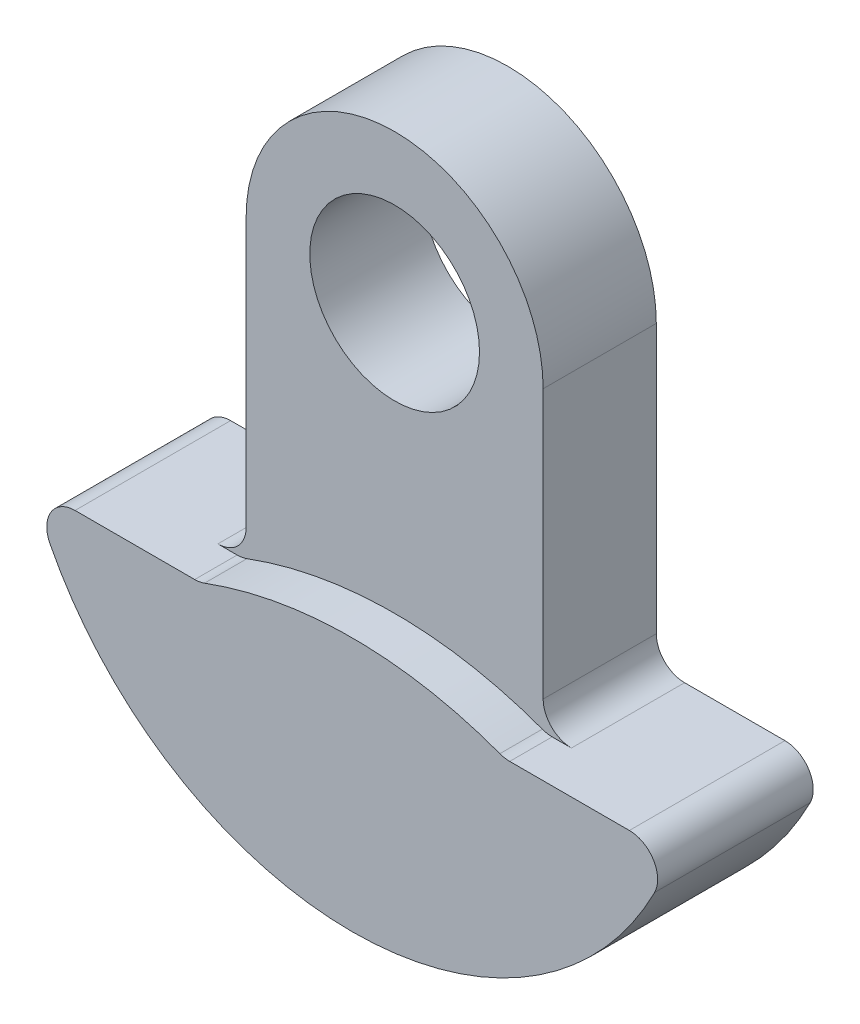
ISO-10303-21;
HEADER;
FILE_DESCRIPTION(('STEP AP214'),'2;1');
FILE_NAME('part.step','',(''),(''),'','','');
FILE_SCHEMA(('AUTOMOTIVE_DESIGN { 1 0 10303 214 1 1 1 1 }'));
ENDSEC;
DATA;
#1=APPLICATION_CONTEXT('core data for automotive mechanical design processes');
#2=APPLICATION_PROTOCOL_DEFINITION('international standard','automotive_design',2000,#1);
#3=PRODUCT_CONTEXT('',#1,'mechanical');
#4=PRODUCT('Part','Part','',(#3));
#5=PRODUCT_RELATED_PRODUCT_CATEGORY('part','',(#4));
#6=PRODUCT_DEFINITION_FORMATION('','',#4);
#7=PRODUCT_DEFINITION_CONTEXT('part definition',#1,'design');
#8=PRODUCT_DEFINITION('design','',#6,#7);
#9=PRODUCT_DEFINITION_SHAPE('','',#8);
#10=(LENGTH_UNIT() NAMED_UNIT(*) SI_UNIT(.MILLI.,.METRE.));
#11=(NAMED_UNIT(*) PLANE_ANGLE_UNIT() SI_UNIT($,.RADIAN.));
#12=(NAMED_UNIT(*) SI_UNIT($,.STERADIAN.) SOLID_ANGLE_UNIT());
#13=UNCERTAINTY_MEASURE_WITH_UNIT(LENGTH_MEASURE(1.E-05),#10,'distance_accuracy_value','');
#14=(GEOMETRIC_REPRESENTATION_CONTEXT(3) GLOBAL_UNCERTAINTY_ASSIGNED_CONTEXT((#13)) GLOBAL_UNIT_ASSIGNED_CONTEXT((#10,
#11,#12)) REPRESENTATION_CONTEXT('',''));
#15=CARTESIAN_POINT('',(0.,0.,0.));
#16=DIRECTION('',(0.,0.,1.));
#17=DIRECTION('',(1.,0.,0.));
#18=AXIS2_PLACEMENT_3D('',#15,#16,#17);
#19=CARTESIAN_POINT('',(-19.5959179422654,-10.,7.99999999999995));
#20=DIRECTION('',(0.,0.,-0.999999999999999));
#21=DIRECTION('',(-1.,0.,0.));
#22=AXIS2_PLACEMENT_3D('',#19,#20,#21);
#23=PLANE('',#22);
#24=CARTESIAN_POINT('',(0.,13.,7.99999999999999));
#25=DIRECTION('',(0.,0.,0.999999999999999));
#26=DIRECTION('',(1.,0.,0.));
#27=AXIS2_PLACEMENT_3D('',#24,#25,#26);
#28=CIRCLE('',#27,6.);
#29=CARTESIAN_POINT('',(6.00000000000002,13.,7.99999999999999));
#30=VERTEX_POINT('',#29);
#31=EDGE_CURVE('E283',#30,#30,#28,.T.);
#32=ORIENTED_EDGE('',*,*,#31,.F.);
#33=EDGE_LOOP('',(#32));
#34=FACE_BOUND('',#33,.T.);
#35=DIRECTION('',(-1.,0.,0.));
#36=VECTOR('',#35,1.);
#37=CARTESIAN_POINT('',(-19.5959179422654,-8.00000000000002,7.99999999999995));
#38=LINE('',#37,#36);
#39=CARTESIAN_POINT('',(-11.1355287256601,-8.00000000000001,7.99999999999995));
#40=VERTEX_POINT('',#39);
#41=CARTESIAN_POINT('',(-12.5,-8.00000000000001,7.99999999999995));
#42=VERTEX_POINT('',#41);
#43=EDGE_CURVE('E49',#40,#42,#38,.T.);
#44=ORIENTED_EDGE('',*,*,#43,.F.);
#45=CARTESIAN_POINT('',(-11.1355287256601,-6.00000000000001,7.99999999999995));
#46=DIRECTION('',(0.,0.,-0.999999999999999));
#47=DIRECTION('',(1.,0.,0.));
#48=AXIS2_PLACEMENT_3D('',#45,#46,#47);
#49=CIRCLE('',#48,2.);
#50=CARTESIAN_POINT('',(-10.4395581803063,-7.87500000000002,7.99999999999995));
#51=VERTEX_POINT('',#50);
#52=EDGE_CURVE('E53',#51,#40,#49,.T.);
#53=ORIENTED_EDGE('',*,*,#52,.F.);
#54=CARTESIAN_POINT('',(0.,-36.,7.99999999999999));
#55=DIRECTION('',(0.,0.,0.999999999999999));
#56=DIRECTION('',(1.,0.,0.));
#57=AXIS2_PLACEMENT_3D('',#54,#55,#56);
#58=CIRCLE('',#57,30.);
#59=CARTESIAN_POINT('',(10.4395581803063,-7.875,7.99999999999999));
#60=VERTEX_POINT('',#59);
#61=EDGE_CURVE('E134',#60,#51,#58,.T.);
#62=ORIENTED_EDGE('',*,*,#61,.F.);
#63=CARTESIAN_POINT('',(11.1355287256601,-6.,7.99999999999999));
#64=DIRECTION('',(0.,0.,-0.999999999999999));
#65=DIRECTION('',(1.,0.,0.));
#66=AXIS2_PLACEMENT_3D('',#63,#64,#65);
#67=CIRCLE('',#66,2.);
#68=CARTESIAN_POINT('',(11.13552872566,-8.,7.99999999999999));
#69=VERTEX_POINT('',#68);
#70=EDGE_CURVE('E131',#69,#60,#67,.T.);
#71=ORIENTED_EDGE('',*,*,#70,.F.);
#72=DIRECTION('',(-1.,0.,0.));
#73=VECTOR('',#72,1.);
#74=CARTESIAN_POINT('',(11.13552872566,-8.,7.99999999999999));
#75=LINE('',#74,#73);
#76=CARTESIAN_POINT('',(12.5,-8.,7.99999999999999));
#77=VERTEX_POINT('',#76);
#78=EDGE_CURVE('E41',#77,#69,#75,.T.);
#79=ORIENTED_EDGE('',*,*,#78,.F.);
#80=CARTESIAN_POINT('',(12.5,-6.,7.99999999999999));
#81=DIRECTION('',(0.,0.,-0.999999999999999));
#82=DIRECTION('',(-1.,0.,0.));
#83=AXIS2_PLACEMENT_3D('',#80,#81,#82);
#84=CIRCLE('',#83,2.);
#85=CARTESIAN_POINT('',(10.5,-5.99999999999998,7.99999999999999));
#86=VERTEX_POINT('',#85);
#87=EDGE_CURVE('E176',#77,#86,#84,.T.);
#88=ORIENTED_EDGE('',*,*,#87,.T.);
#89=DIRECTION('',(0.,1.,0.));
#90=VECTOR('',#89,1.);
#91=CARTESIAN_POINT('',(10.5,13.,7.99999999999999));
#92=LINE('',#91,#90);
#93=CARTESIAN_POINT('',(10.5,13.,7.99999999999999));
#94=VERTEX_POINT('',#93);
#95=EDGE_CURVE('E178',#86,#94,#92,.T.);
#96=ORIENTED_EDGE('',*,*,#95,.T.);
#97=CARTESIAN_POINT('',(0.,13.,7.99999999999999));
#98=DIRECTION('',(0.,0.,0.999999999999999));
#99=DIRECTION('',(1.,0.,0.));
#100=AXIS2_PLACEMENT_3D('',#97,#98,#99);
#101=CIRCLE('',#100,10.5);
#102=CARTESIAN_POINT('',(-10.5,13.,7.99999999999995));
#103=VERTEX_POINT('',#102);
#104=EDGE_CURVE('E245',#94,#103,#101,.T.);
#105=ORIENTED_EDGE('',*,*,#104,.T.);
#106=DIRECTION('',(0.,-1.,0.));
#107=VECTOR('',#106,1.);
#108=CARTESIAN_POINT('',(-10.5,13.,7.99999999999995));
#109=LINE('',#108,#107);
#110=CARTESIAN_POINT('',(-10.5,-6.,7.99999999999995));
#111=VERTEX_POINT('',#110);
#112=EDGE_CURVE('E185',#103,#111,#109,.T.);
#113=ORIENTED_EDGE('',*,*,#112,.T.);
#114=CARTESIAN_POINT('',(-12.5,-6.00000000000001,7.99999999999995));
#115=DIRECTION('',(0.,0.,-0.999999999999999));
#116=DIRECTION('',(-1.,0.,0.));
#117=AXIS2_PLACEMENT_3D('',#114,#115,#116);
#118=CIRCLE('',#117,2.);
#119=EDGE_CURVE('E182',#111,#42,#118,.T.);
#120=ORIENTED_EDGE('',*,*,#119,.T.);
#121=EDGE_LOOP('',(#44,#53,#62,#71,#79,#88,#96,#105,#113,#120));
#122=FACE_BOUND('',#121,.T.);
#123=ADVANCED_FACE('F32',(#34,#122),#23,.F.);
#124=CARTESIAN_POINT('',(-19.5959179422654,-10.,7.99999999999995));
#125=DIRECTION('',(0.,0.,-0.999999999999999));
#126=DIRECTION('',(-1.,0.,0.));
#127=AXIS2_PLACEMENT_3D('',#124,#125,#126);
#128=CYLINDRICAL_SURFACE('',#127,2.);
#129=CARTESIAN_POINT('',(-19.5959179422654,-10.,0.));
#130=DIRECTION('',(0.,0.,0.999999999999999));
#131=DIRECTION('',(-1.,0.,0.));
#132=AXIS2_PLACEMENT_3D('',#129,#130,#131);
#133=CIRCLE('',#132,2.);
#134=CARTESIAN_POINT('',(-19.5959179422654,-8.00000000000002,0.));
#135=VERTEX_POINT('',#134);
#136=CARTESIAN_POINT('',(-21.3773650279259,-10.9090909090909,0.));
#137=VERTEX_POINT('',#136);
#138=EDGE_CURVE('E153',#135,#137,#133,.T.);
#139=ORIENTED_EDGE('',*,*,#138,.T.);
#140=DIRECTION('',(0.,0.,-0.999999999999999));
#141=VECTOR('',#140,1.);
#142=CARTESIAN_POINT('',(-21.3773650279259,-10.9090909090909,7.99999999999995));
#143=LINE('',#142,#141);
#144=CARTESIAN_POINT('',(-21.3773650279259,-10.9090909090909,11.));
#145=VERTEX_POINT('',#144);
#146=EDGE_CURVE('E149',#145,#137,#143,.T.);
#147=ORIENTED_EDGE('',*,*,#146,.F.);
#148=CARTESIAN_POINT('',(-19.5959179422654,-10.,11.));
#149=DIRECTION('',(0.,0.,0.999999999999999));
#150=DIRECTION('',(1.,0.,0.));
#151=AXIS2_PLACEMENT_3D('',#148,#149,#150);
#152=CIRCLE('',#151,2.);
#153=CARTESIAN_POINT('',(-19.5959179422654,-8.00000000000002,11.));
#154=VERTEX_POINT('',#153);
#155=EDGE_CURVE('E164',#154,#145,#152,.T.);
#156=ORIENTED_EDGE('',*,*,#155,.F.);
#157=DIRECTION('',(0.,0.,-0.999999999999999));
#158=VECTOR('',#157,1.);
#159=CARTESIAN_POINT('',(-19.5959179422654,-8.00000000000002,7.99999999999995));
#160=LINE('',#159,#158);
#161=EDGE_CURVE('E184',#154,#135,#160,.T.);
#162=ORIENTED_EDGE('',*,*,#161,.T.);
#163=EDGE_LOOP('',(#139,#147,#156,#162));
#164=FACE_BOUND('',#163,.T.);
#165=ADVANCED_FACE('F34',(#164),#128,.T.);
#166=CARTESIAN_POINT('',(0.,0.,7.99999999999999));
#167=DIRECTION('',(0.,0.,-0.999999999999999));
#168=DIRECTION('',(-1.,0.,0.));
#169=AXIS2_PLACEMENT_3D('',#166,#167,#168);
#170=CYLINDRICAL_SURFACE('',#169,24.);
#171=CARTESIAN_POINT('',(0.,0.,0.));
#172=DIRECTION('',(0.,0.,0.999999999999999));
#173=DIRECTION('',(1.,0.,0.));
#174=AXIS2_PLACEMENT_3D('',#171,#172,#173);
#175=CIRCLE('',#174,24.);
#176=CARTESIAN_POINT('',(21.3773650279259,-10.9090909090909,0.));
#177=VERTEX_POINT('',#176);
#178=EDGE_CURVE('E157',#137,#177,#175,.T.);
#179=ORIENTED_EDGE('',*,*,#178,.T.);
#180=DIRECTION('',(0.,0.,-0.999999999999999));
#181=VECTOR('',#180,1.);
#182=CARTESIAN_POINT('',(21.3773650279259,-10.9090909090909,7.99999999999999));
#183=LINE('',#182,#181);
#184=CARTESIAN_POINT('',(21.3773650279259,-10.9090909090909,11.));
#185=VERTEX_POINT('',#184);
#186=EDGE_CURVE('E215',#185,#177,#183,.T.);
#187=ORIENTED_EDGE('',*,*,#186,.F.);
#188=CARTESIAN_POINT('',(0.,0.,11.));
#189=DIRECTION('',(0.,0.,0.999999999999999));
#190=DIRECTION('',(1.,0.,0.));
#191=AXIS2_PLACEMENT_3D('',#188,#189,#190);
#192=CIRCLE('',#191,24.);
#193=EDGE_CURVE('E222',#145,#185,#192,.T.);
#194=ORIENTED_EDGE('',*,*,#193,.F.);
#195=ORIENTED_EDGE('',*,*,#146,.T.);
#196=EDGE_LOOP('',(#179,#187,#194,#195));
#197=FACE_BOUND('',#196,.T.);
#198=ADVANCED_FACE('F220',(#197),#170,.T.);
#199=CARTESIAN_POINT('',(19.5959179422654,-9.99999999999999,7.99999999999999));
#200=DIRECTION('',(0.,0.,-0.999999999999999));
#201=DIRECTION('',(-1.,0.,0.));
#202=AXIS2_PLACEMENT_3D('',#199,#200,#201);
#203=CYLINDRICAL_SURFACE('',#202,2.);
#204=CARTESIAN_POINT('',(19.5959179422654,-9.99999999999999,0.));
#205=DIRECTION('',(0.,0.,0.999999999999999));
#206=DIRECTION('',(1.,0.,0.));
#207=AXIS2_PLACEMENT_3D('',#204,#205,#206);
#208=CIRCLE('',#207,2.);
#209=CARTESIAN_POINT('',(19.5959179422654,-7.99999999999999,0.));
#210=VERTEX_POINT('',#209);
#211=EDGE_CURVE('E229',#177,#210,#208,.T.);
#212=ORIENTED_EDGE('',*,*,#211,.T.);
#213=DIRECTION('',(0.,0.,-0.999999999999999));
#214=VECTOR('',#213,1.);
#215=CARTESIAN_POINT('',(19.5959179422654,-7.99999999999999,7.99999999999999));
#216=LINE('',#215,#214);
#217=CARTESIAN_POINT('',(19.5959179422654,-7.99999999999999,11.));
#218=VERTEX_POINT('',#217);
#219=EDGE_CURVE('E172',#218,#210,#216,.T.);
#220=ORIENTED_EDGE('',*,*,#219,.F.);
#221=CARTESIAN_POINT('',(19.5959179422654,-9.99999999999999,11.));
#222=DIRECTION('',(0.,0.,0.999999999999999));
#223=DIRECTION('',(-1.,0.,0.));
#224=AXIS2_PLACEMENT_3D('',#221,#222,#223);
#225=CIRCLE('',#224,2.);
#226=EDGE_CURVE('E276',#185,#218,#225,.T.);
#227=ORIENTED_EDGE('',*,*,#226,.F.);
#228=ORIENTED_EDGE('',*,*,#186,.T.);
#229=EDGE_LOOP('',(#212,#220,#227,#228));
#230=FACE_BOUND('',#229,.T.);
#231=ADVANCED_FACE('F344',(#230),#203,.T.);
#232=CARTESIAN_POINT('',(19.5959179422654,-7.99999999999999,7.99999999999999));
#233=DIRECTION('',(0.,-1.,0.));
#234=DIRECTION('',(1.,0.,0.));
#235=AXIS2_PLACEMENT_3D('',#232,#233,#234);
#236=PLANE('',#235);
#237=DIRECTION('',(-1.,0.,0.));
#238=VECTOR('',#237,1.);
#239=CARTESIAN_POINT('',(19.5959179422654,-7.99999999999999,0.));
#240=LINE('',#239,#238);
#241=CARTESIAN_POINT('',(12.5,-8.,0.));
#242=VERTEX_POINT('',#241);
#243=EDGE_CURVE('E230',#210,#242,#240,.T.);
#244=ORIENTED_EDGE('',*,*,#243,.T.);
#245=DIRECTION('',(0.,0.,-0.999999999999999));
#246=VECTOR('',#245,1.);
#247=CARTESIAN_POINT('',(12.5,-8.,7.99999999999999));
#248=LINE('',#247,#246);
#249=EDGE_CURVE('E147',#77,#242,#248,.T.);
#250=ORIENTED_EDGE('',*,*,#249,.F.);
#251=ORIENTED_EDGE('',*,*,#78,.T.);
#252=DIRECTION('',(0.,0.,-0.999999999999999));
#253=VECTOR('',#252,1.);
#254=CARTESIAN_POINT('',(11.13552872566,-8.,11.));
#255=LINE('',#254,#253);
#256=CARTESIAN_POINT('',(11.13552872566,-8.,11.));
#257=VERTEX_POINT('',#256);
#258=EDGE_CURVE('E144',#257,#69,#255,.T.);
#259=ORIENTED_EDGE('',*,*,#258,.F.);
#260=DIRECTION('',(-1.,0.,0.));
#261=VECTOR('',#260,1.);
#262=CARTESIAN_POINT('',(11.13552872566,-8.,11.));
#263=LINE('',#262,#261);
#264=EDGE_CURVE('E274',#218,#257,#263,.T.);
#265=ORIENTED_EDGE('',*,*,#264,.F.);
#266=ORIENTED_EDGE('',*,*,#219,.T.);
#267=EDGE_LOOP('',(#244,#250,#251,#259,#265,#266));
#268=FACE_BOUND('',#267,.T.);
#269=ADVANCED_FACE('F142',(#268),#236,.F.);
#270=CARTESIAN_POINT('',(12.5,-6.,7.99999999999999));
#271=DIRECTION('',(0.,0.,-0.999999999999999));
#272=DIRECTION('',(-1.,0.,0.));
#273=AXIS2_PLACEMENT_3D('',#270,#271,#272);
#274=CYLINDRICAL_SURFACE('',#273,2.);
#275=CARTESIAN_POINT('',(12.5,-6.,0.));
#276=DIRECTION('',(0.,0.,-0.999999999999999));
#277=DIRECTION('',(-1.,0.,0.));
#278=AXIS2_PLACEMENT_3D('',#275,#276,#277);
#279=CIRCLE('',#278,2.);
#280=CARTESIAN_POINT('',(10.5,-5.99999999999999,0.));
#281=VERTEX_POINT('',#280);
#282=EDGE_CURVE('E234',#242,#281,#279,.T.);
#283=ORIENTED_EDGE('',*,*,#282,.T.);
#284=DIRECTION('',(0.,0.,-0.999999999999999));
#285=VECTOR('',#284,1.);
#286=CARTESIAN_POINT('',(10.5,-5.99999999999998,7.99999999999999));
#287=LINE('',#286,#285);
#288=EDGE_CURVE('E173',#86,#281,#287,.T.);
#289=ORIENTED_EDGE('',*,*,#288,.F.);
#290=ORIENTED_EDGE('',*,*,#87,.F.);
#291=ORIENTED_EDGE('',*,*,#249,.T.);
#292=EDGE_LOOP('',(#283,#289,#290,#291));
#293=FACE_BOUND('',#292,.T.);
#294=ADVANCED_FACE('F337',(#293),#274,.F.);
#295=CARTESIAN_POINT('',(10.5,13.,7.99999999999999));
#296=DIRECTION('',(-1.,0.,0.));
#297=DIRECTION('',(0.,-1.,0.));
#298=AXIS2_PLACEMENT_3D('',#295,#296,#297);
#299=PLANE('',#298);
#300=DIRECTION('',(0.,1.,0.));
#301=VECTOR('',#300,1.);
#302=CARTESIAN_POINT('',(10.5,13.,0.));
#303=LINE('',#302,#301);
#304=CARTESIAN_POINT('',(10.5,13.,0.));
#305=VERTEX_POINT('',#304);
#306=EDGE_CURVE('E236',#281,#305,#303,.T.);
#307=ORIENTED_EDGE('',*,*,#306,.T.);
#308=DIRECTION('',(0.,0.,-0.999999999999999));
#309=VECTOR('',#308,1.);
#310=CARTESIAN_POINT('',(10.5,13.,7.99999999999999));
#311=LINE('',#310,#309);
#312=EDGE_CURVE('E208',#94,#305,#311,.T.);
#313=ORIENTED_EDGE('',*,*,#312,.F.);
#314=ORIENTED_EDGE('',*,*,#95,.F.);
#315=ORIENTED_EDGE('',*,*,#288,.T.);
#316=EDGE_LOOP('',(#307,#313,#314,#315));
#317=FACE_BOUND('',#316,.T.);
#318=ADVANCED_FACE('F333',(#317),#299,.F.);
#319=CARTESIAN_POINT('',(0.,13.,7.99999999999999));
#320=DIRECTION('',(0.,0.,-0.999999999999999));
#321=DIRECTION('',(-1.,0.,0.));
#322=AXIS2_PLACEMENT_3D('',#319,#320,#321);
#323=CYLINDRICAL_SURFACE('',#322,10.5);
#324=CARTESIAN_POINT('',(0.,13.,0.));
#325=DIRECTION('',(0.,0.,0.999999999999999));
#326=DIRECTION('',(1.,0.,0.));
#327=AXIS2_PLACEMENT_3D('',#324,#325,#326);
#328=CIRCLE('',#327,10.5);
#329=CARTESIAN_POINT('',(-10.5,13.,0.));
#330=VERTEX_POINT('',#329);
#331=EDGE_CURVE('E238',#305,#330,#328,.T.);
#332=ORIENTED_EDGE('',*,*,#331,.T.);
#333=DIRECTION('',(0.,0.,-0.999999999999999));
#334=VECTOR('',#333,1.);
#335=CARTESIAN_POINT('',(-10.5,13.,7.99999999999995));
#336=LINE('',#335,#334);
#337=EDGE_CURVE('E196',#103,#330,#336,.T.);
#338=ORIENTED_EDGE('',*,*,#337,.F.);
#339=ORIENTED_EDGE('',*,*,#104,.F.);
#340=ORIENTED_EDGE('',*,*,#312,.T.);
#341=EDGE_LOOP('',(#332,#338,#339,#340));
#342=FACE_BOUND('',#341,.T.);
#343=ADVANCED_FACE('F330',(#342),#323,.T.);
#344=CARTESIAN_POINT('',(-10.5,13.,7.99999999999995));
#345=DIRECTION('',(1.,0.,0.));
#346=DIRECTION('',(0.,1.,0.));
#347=AXIS2_PLACEMENT_3D('',#344,#345,#346);
#348=PLANE('',#347);
#349=DIRECTION('',(0.,-1.,0.));
#350=VECTOR('',#349,1.);
#351=CARTESIAN_POINT('',(-10.5,13.,0.));
#352=LINE('',#351,#350);
#353=CARTESIAN_POINT('',(-10.5,-6.,0.));
#354=VERTEX_POINT('',#353);
#355=EDGE_CURVE('E240',#330,#354,#352,.T.);
#356=ORIENTED_EDGE('',*,*,#355,.T.);
#357=DIRECTION('',(0.,0.,-0.999999999999999));
#358=VECTOR('',#357,1.);
#359=CARTESIAN_POINT('',(-10.5,-6.,7.99999999999995));
#360=LINE('',#359,#358);
#361=EDGE_CURVE('E190',#111,#354,#360,.T.);
#362=ORIENTED_EDGE('',*,*,#361,.F.);
#363=ORIENTED_EDGE('',*,*,#112,.F.);
#364=ORIENTED_EDGE('',*,*,#337,.T.);
#365=EDGE_LOOP('',(#356,#362,#363,#364));
#366=FACE_BOUND('',#365,.T.);
#367=ADVANCED_FACE('F252',(#366),#348,.F.);
#368=CARTESIAN_POINT('',(-12.5,-6.00000000000001,7.99999999999995));
#369=DIRECTION('',(0.,0.,-0.999999999999999));
#370=DIRECTION('',(-1.,0.,0.));
#371=AXIS2_PLACEMENT_3D('',#368,#369,#370);
#372=CYLINDRICAL_SURFACE('',#371,2.);
#373=CARTESIAN_POINT('',(-12.5,-6.00000000000001,0.));
#374=DIRECTION('',(0.,0.,-0.999999999999999));
#375=DIRECTION('',(-1.,0.,0.));
#376=AXIS2_PLACEMENT_3D('',#373,#374,#375);
#377=CIRCLE('',#376,2.);
#378=CARTESIAN_POINT('',(-12.5,-8.00000000000001,0.));
#379=VERTEX_POINT('',#378);
#380=EDGE_CURVE('E242',#354,#379,#377,.T.);
#381=ORIENTED_EDGE('',*,*,#380,.T.);
#382=DIRECTION('',(0.,0.,-0.999999999999999));
#383=VECTOR('',#382,1.);
#384=CARTESIAN_POINT('',(-12.5,-8.00000000000001,7.99999999999995));
#385=LINE('',#384,#383);
#386=EDGE_CURVE('E188',#42,#379,#385,.T.);
#387=ORIENTED_EDGE('',*,*,#386,.F.);
#388=ORIENTED_EDGE('',*,*,#119,.F.);
#389=ORIENTED_EDGE('',*,*,#361,.T.);
#390=EDGE_LOOP('',(#381,#387,#388,#389));
#391=FACE_BOUND('',#390,.T.);
#392=ADVANCED_FACE('F255',(#391),#372,.F.);
#393=CARTESIAN_POINT('',(-19.5959179422654,-8.00000000000002,7.99999999999995));
#394=DIRECTION('',(0.,-1.,0.));
#395=DIRECTION('',(0.,0.,-0.999999999999999));
#396=AXIS2_PLACEMENT_3D('',#393,#394,#395);
#397=PLANE('',#396);
#398=DIRECTION('',(-1.,0.,0.));
#399=VECTOR('',#398,1.);
#400=CARTESIAN_POINT('',(-19.5959179422654,-8.00000000000002,0.));
#401=LINE('',#400,#399);
#402=EDGE_CURVE('E179',#379,#135,#401,.T.);
#403=ORIENTED_EDGE('',*,*,#402,.T.);
#404=ORIENTED_EDGE('',*,*,#161,.F.);
#405=DIRECTION('',(-1.,0.,0.));
#406=VECTOR('',#405,1.);
#407=CARTESIAN_POINT('',(-19.5959179422654,-8.00000000000002,11.));
#408=LINE('',#407,#406);
#409=CARTESIAN_POINT('',(-11.1355287256601,-8.00000000000001,11.));
#410=VERTEX_POINT('',#409);
#411=EDGE_CURVE('E262',#410,#154,#408,.T.);
#412=ORIENTED_EDGE('',*,*,#411,.F.);
#413=DIRECTION('',(0.,0.,-0.999999999999999));
#414=VECTOR('',#413,1.);
#415=CARTESIAN_POINT('',(-11.1355287256601,-8.00000000000001,11.));
#416=LINE('',#415,#414);
#417=EDGE_CURVE('E260',#410,#40,#416,.T.);
#418=ORIENTED_EDGE('',*,*,#417,.T.);
#419=ORIENTED_EDGE('',*,*,#43,.T.);
#420=ORIENTED_EDGE('',*,*,#386,.T.);
#421=EDGE_LOOP('',(#403,#404,#412,#418,#419,#420));
#422=FACE_BOUND('',#421,.T.);
#423=ADVANCED_FACE('F257',(#422),#397,.F.);
#424=CARTESIAN_POINT('',(-19.5959179422654,-10.,0.));
#425=DIRECTION('',(0.,0.,-0.999999999999999));
#426=DIRECTION('',(-1.,0.,0.));
#427=AXIS2_PLACEMENT_3D('',#424,#425,#426);
#428=PLANE('',#427);
#429=CARTESIAN_POINT('',(0.,0.,0.));
#430=DIRECTION('',(0.,0.,-0.999999999999999));
#431=DIRECTION('',(-1.,0.,0.));
#432=AXIS2_PLACEMENT_3D('',#429,#430,#431);
#433=CIRCLE('',#432,6.5);
#434=CARTESIAN_POINT('',(6.50000000000001,0.,0.));
#435=VERTEX_POINT('',#434);
#436=EDGE_CURVE('E11',#435,#435,#433,.T.);
#437=ORIENTED_EDGE('',*,*,#436,.F.);
#438=EDGE_LOOP('',(#437));
#439=FACE_BOUND('',#438,.T.);
#440=CARTESIAN_POINT('',(0.,13.,0.));
#441=DIRECTION('',(0.,0.,-0.999999999999999));
#442=DIRECTION('',(-1.,0.,0.));
#443=AXIS2_PLACEMENT_3D('',#440,#441,#442);
#444=CIRCLE('',#443,6.);
#445=CARTESIAN_POINT('',(6.00000000000002,13.,0.));
#446=VERTEX_POINT('',#445);
#447=EDGE_CURVE('E36',#446,#446,#444,.T.);
#448=ORIENTED_EDGE('',*,*,#447,.F.);
#449=EDGE_LOOP('',(#448));
#450=FACE_BOUND('',#449,.T.);
#451=ORIENTED_EDGE('',*,*,#138,.F.);
#452=ORIENTED_EDGE('',*,*,#402,.F.);
#453=ORIENTED_EDGE('',*,*,#380,.F.);
#454=ORIENTED_EDGE('',*,*,#355,.F.);
#455=ORIENTED_EDGE('',*,*,#331,.F.);
#456=ORIENTED_EDGE('',*,*,#306,.F.);
#457=ORIENTED_EDGE('',*,*,#282,.F.);
#458=ORIENTED_EDGE('',*,*,#243,.F.);
#459=ORIENTED_EDGE('',*,*,#211,.F.);
#460=ORIENTED_EDGE('',*,*,#178,.F.);
#461=EDGE_LOOP('',(#451,#452,#453,#454,#455,#456,#457,#458,#459,#460));
#462=FACE_BOUND('',#461,.T.);
#463=ADVANCED_FACE('F225',(#439,#450,#462),#428,.T.);
#464=CARTESIAN_POINT('',(11.1355287256601,-6.,11.));
#465=DIRECTION('',(0.,0.,-0.999999999999999));
#466=DIRECTION('',(-1.,0.,0.));
#467=AXIS2_PLACEMENT_3D('',#464,#465,#466);
#468=CYLINDRICAL_SURFACE('',#467,2.);
#469=ORIENTED_EDGE('',*,*,#70,.T.);
#470=DIRECTION('',(0.,0.,-0.999999999999999));
#471=VECTOR('',#470,1.);
#472=CARTESIAN_POINT('',(10.4395581803063,-7.875,11.));
#473=LINE('',#472,#471);
#474=CARTESIAN_POINT('',(10.4395581803063,-7.875,11.));
#475=VERTEX_POINT('',#474);
#476=EDGE_CURVE('E154',#475,#60,#473,.T.);
#477=ORIENTED_EDGE('',*,*,#476,.F.);
#478=CARTESIAN_POINT('',(11.1355287256601,-6.,11.));
#479=DIRECTION('',(0.,0.,-0.999999999999999));
#480=DIRECTION('',(1.,0.,0.));
#481=AXIS2_PLACEMENT_3D('',#478,#479,#480);
#482=CIRCLE('',#481,2.);
#483=EDGE_CURVE('E152',#257,#475,#482,.T.);
#484=ORIENTED_EDGE('',*,*,#483,.F.);
#485=ORIENTED_EDGE('',*,*,#258,.T.);
#486=EDGE_LOOP('',(#469,#477,#484,#485));
#487=FACE_BOUND('',#486,.T.);
#488=ADVANCED_FACE('F151',(#487),#468,.F.);
#489=CARTESIAN_POINT('',(0.,-36.,11.));
#490=DIRECTION('',(0.,0.,-0.999999999999999));
#491=DIRECTION('',(-1.,0.,0.));
#492=AXIS2_PLACEMENT_3D('',#489,#490,#491);
#493=CYLINDRICAL_SURFACE('',#492,30.);
#494=ORIENTED_EDGE('',*,*,#61,.T.);
#495=DIRECTION('',(0.,0.,-0.999999999999999));
#496=VECTOR('',#495,1.);
#497=CARTESIAN_POINT('',(-10.4395581803063,-7.87500000000002,11.));
#498=LINE('',#497,#496);
#499=CARTESIAN_POINT('',(-10.4395581803063,-7.87500000000002,11.));
#500=VERTEX_POINT('',#499);
#501=EDGE_CURVE('E159',#500,#51,#498,.T.);
#502=ORIENTED_EDGE('',*,*,#501,.F.);
#503=CARTESIAN_POINT('',(0.,-36.,11.));
#504=DIRECTION('',(0.,0.,0.999999999999999));
#505=DIRECTION('',(1.,0.,0.));
#506=AXIS2_PLACEMENT_3D('',#503,#504,#505);
#507=CIRCLE('',#506,30.);
#508=EDGE_CURVE('E271',#475,#500,#507,.T.);
#509=ORIENTED_EDGE('',*,*,#508,.F.);
#510=ORIENTED_EDGE('',*,*,#476,.T.);
#511=EDGE_LOOP('',(#494,#502,#509,#510));
#512=FACE_BOUND('',#511,.T.);
#513=ADVANCED_FACE('F396',(#512),#493,.T.);
#514=CARTESIAN_POINT('',(-11.1355287256601,-6.00000000000001,11.));
#515=DIRECTION('',(0.,0.,-0.999999999999999));
#516=DIRECTION('',(-1.,0.,0.));
#517=AXIS2_PLACEMENT_3D('',#514,#515,#516);
#518=CYLINDRICAL_SURFACE('',#517,2.);
#519=ORIENTED_EDGE('',*,*,#52,.T.);
#520=ORIENTED_EDGE('',*,*,#417,.F.);
#521=CARTESIAN_POINT('',(-11.1355287256601,-6.00000000000001,11.));
#522=DIRECTION('',(0.,0.,-0.999999999999999));
#523=DIRECTION('',(1.,0.,0.));
#524=AXIS2_PLACEMENT_3D('',#521,#522,#523);
#525=CIRCLE('',#524,2.);
#526=EDGE_CURVE('E267',#500,#410,#525,.T.);
#527=ORIENTED_EDGE('',*,*,#526,.F.);
#528=ORIENTED_EDGE('',*,*,#501,.T.);
#529=EDGE_LOOP('',(#519,#520,#527,#528));
#530=FACE_BOUND('',#529,.T.);
#531=ADVANCED_FACE('F402',(#530),#518,.F.);
#532=CARTESIAN_POINT('',(-19.5959179422654,-10.,11.));
#533=DIRECTION('',(0.,0.,0.999999999999999));
#534=DIRECTION('',(1.,0.,0.));
#535=AXIS2_PLACEMENT_3D('',#532,#533,#534);
#536=PLANE('',#535);
#537=ORIENTED_EDGE('',*,*,#155,.T.);
#538=ORIENTED_EDGE('',*,*,#193,.T.);
#539=ORIENTED_EDGE('',*,*,#226,.T.);
#540=ORIENTED_EDGE('',*,*,#264,.T.);
#541=ORIENTED_EDGE('',*,*,#483,.T.);
#542=ORIENTED_EDGE('',*,*,#508,.T.);
#543=ORIENTED_EDGE('',*,*,#526,.T.);
#544=ORIENTED_EDGE('',*,*,#411,.T.);
#545=EDGE_LOOP('',(#537,#538,#539,#540,#541,#542,#543,#544));
#546=FACE_BOUND('',#545,.T.);
#547=ADVANCED_FACE('F311',(#546),#536,.T.);
#548=CARTESIAN_POINT('',(0.,13.,-2.50000000007189E-05));
#549=DIRECTION('',(0.,0.,0.999999999999999));
#550=DIRECTION('',(1.,0.,0.));
#551=AXIS2_PLACEMENT_3D('',#548,#549,#550);
#552=CYLINDRICAL_SURFACE('',#551,6.);
#553=CARTESIAN_POINT('',(6.00000000000002,13.,0.));
#554=CARTESIAN_POINT('',(6.00000000000002,13.,0.0833333333333333));
#555=CARTESIAN_POINT('',(6.00000000000002,13.,0.166666666666667));
#556=CARTESIAN_POINT('',(6.00000000000002,13.,0.333333333333333));
#557=CARTESIAN_POINT('',(6.00000000000002,13.,0.416666666666666));
#558=CARTESIAN_POINT('',(6.00000000000002,13.,0.583333333333333));
#559=CARTESIAN_POINT('',(6.00000000000002,13.,0.666666666666666));
#560=CARTESIAN_POINT('',(6.00000000000002,13.,0.833333333333333));
#561=CARTESIAN_POINT('',(6.00000000000002,13.,0.916666666666666));
#562=CARTESIAN_POINT('',(6.00000000000002,13.,1.08333333333333));
#563=CARTESIAN_POINT('',(6.00000000000002,13.,1.16666666666667));
#564=CARTESIAN_POINT('',(6.00000000000002,13.,1.33333333333333));
#565=CARTESIAN_POINT('',(6.00000000000002,13.,1.41666666666667));
#566=CARTESIAN_POINT('',(6.00000000000002,13.,1.58333333333333));
#567=CARTESIAN_POINT('',(6.00000000000002,13.,1.66666666666667));
#568=CARTESIAN_POINT('',(6.00000000000002,13.,1.83333333333333));
#569=CARTESIAN_POINT('',(6.00000000000002,13.,1.91666666666666));
#570=CARTESIAN_POINT('',(6.00000000000002,13.,2.08333333333333));
#571=CARTESIAN_POINT('',(6.00000000000002,13.,2.16666666666667));
#572=CARTESIAN_POINT('',(6.00000000000002,13.,2.33333333333333));
#573=CARTESIAN_POINT('',(6.00000000000002,13.,2.41666666666667));
#574=CARTESIAN_POINT('',(6.00000000000002,13.,2.58333333333333));
#575=CARTESIAN_POINT('',(6.00000000000002,13.,2.66666666666666));
#576=CARTESIAN_POINT('',(6.00000000000002,13.,2.83333333333333));
#577=CARTESIAN_POINT('',(6.00000000000002,13.,2.91666666666666));
#578=CARTESIAN_POINT('',(6.00000000000002,13.,3.08333333333333));
#579=CARTESIAN_POINT('',(6.00000000000002,13.,3.16666666666666));
#580=CARTESIAN_POINT('',(6.00000000000002,13.,3.33333333333333));
#581=CARTESIAN_POINT('',(6.00000000000002,13.,3.41666666666666));
#582=CARTESIAN_POINT('',(6.00000000000002,13.,3.58333333333333));
#583=CARTESIAN_POINT('',(6.00000000000002,13.,3.66666666666666));
#584=CARTESIAN_POINT('',(6.00000000000002,13.,3.83333333333333));
#585=CARTESIAN_POINT('',(6.00000000000002,13.,3.91666666666666));
#586=CARTESIAN_POINT('',(6.00000000000002,13.,4.08333333333333));
#587=CARTESIAN_POINT('',(6.00000000000002,13.,4.16666666666666));
#588=CARTESIAN_POINT('',(6.00000000000002,13.,4.33333333333333));
#589=CARTESIAN_POINT('',(6.00000000000002,13.,4.41666666666666));
#590=CARTESIAN_POINT('',(6.00000000000002,13.,4.58333333333333));
#591=CARTESIAN_POINT('',(6.00000000000002,13.,4.66666666666666));
#592=CARTESIAN_POINT('',(6.00000000000002,13.,4.83333333333333));
#593=CARTESIAN_POINT('',(6.00000000000002,13.,4.91666666666666));
#594=CARTESIAN_POINT('',(6.00000000000002,13.,5.08333333333333));
#595=CARTESIAN_POINT('',(6.00000000000002,13.,5.16666666666666));
#596=CARTESIAN_POINT('',(6.00000000000002,13.,5.33333333333333));
#597=CARTESIAN_POINT('',(6.00000000000002,13.,5.41666666666666));
#598=CARTESIAN_POINT('',(6.00000000000002,13.,5.58333333333333));
#599=CARTESIAN_POINT('',(6.00000000000002,13.,5.66666666666666));
#600=CARTESIAN_POINT('',(6.00000000000002,13.,5.83333333333333));
#601=CARTESIAN_POINT('',(6.00000000000002,13.,5.91666666666666));
#602=CARTESIAN_POINT('',(6.00000000000002,13.,6.08333333333333));
#603=CARTESIAN_POINT('',(6.00000000000002,13.,6.16666666666666));
#604=CARTESIAN_POINT('',(6.00000000000002,13.,6.33333333333333));
#605=CARTESIAN_POINT('',(6.00000000000002,13.,6.41666666666666));
#606=CARTESIAN_POINT('',(6.00000000000002,13.,6.58333333333333));
#607=CARTESIAN_POINT('',(6.00000000000002,13.,6.66666666666666));
#608=CARTESIAN_POINT('',(6.00000000000002,13.,6.83333333333333));
#609=CARTESIAN_POINT('',(6.00000000000002,13.,6.91666666666666));
#610=CARTESIAN_POINT('',(6.00000000000002,13.,7.08333333333333));
#611=CARTESIAN_POINT('',(6.00000000000002,13.,7.16666666666666));
#612=CARTESIAN_POINT('',(6.00000000000002,13.,7.33333333333333));
#613=CARTESIAN_POINT('',(6.00000000000002,13.,7.41666666666666));
#614=CARTESIAN_POINT('',(6.00000000000002,13.,7.58333333333333));
#615=CARTESIAN_POINT('',(6.00000000000002,13.,7.66666666666666));
#616=CARTESIAN_POINT('',(6.00000000000002,13.,7.83333333333333));
#617=CARTESIAN_POINT('',(6.00000000000002,13.,7.91666666666666));
#618=CARTESIAN_POINT('',(6.00000000000002,13.,7.99999999999999));
#619=B_SPLINE_CURVE_WITH_KNOTS('',3,(#553,#554,#555,#556,#557,#558,#559,#560,#561,#562,#563,
#564,#565,#566,#567,#568,#569,#570,#571,#572,#573,#574,#575,#576,#577,#578,#579,#580,#581,#582,
#583,#584,#585,#586,#587,#588,#589,#590,#591,#592,#593,#594,#595,#596,#597,#598,#599,#600,#601,
#602,#603,#604,#605,#606,#607,#608,#609,#610,#611,#612,#613,#614,#615,#616,#617,#618),
.UNSPECIFIED.,.F.,.F.,(4,2,2,2,2,2,2,2,2,2,2,2,2,2,2,2,2,2,2,2,2,2,2,2,2,2,2,2,2,2,2,2,4),(0.,
0.25,0.5,0.749999999999999,0.999999999999999,1.25,1.5,1.75,2.,2.25,2.5,2.75,3.,3.25,3.5,3.75,4.,
4.25,4.5,4.75,5.,5.25,5.5,5.75,6.,6.25,6.5,6.74999999999999,6.99999999999999,7.24999999999999,
7.49999999999999,7.74999999999999,7.99999999999999),.UNSPECIFIED.);
#620=EDGE_CURVE('BSEAM301',#446,#30,#619,.T.);
#621=ORIENTED_EDGE('',*,*,#447,.T.);
#622=ORIENTED_EDGE('',*,*,#31,.T.);
#623=ORIENTED_EDGE('',*,*,#620,.T.);
#624=ORIENTED_EDGE('',*,*,#620,.F.);
#625=EDGE_LOOP('',(#621,#623,#622,#624));
#626=FACE_BOUND('',#625,.T.);
#627=ADVANCED_FACE('F301',(#626),#552,.F.);
#628=CARTESIAN_POINT('',(0.,0.,-1.));
#629=DIRECTION('',(0.,0.,-0.999999999999999));
#630=DIRECTION('',(-1.,0.,0.));
#631=AXIS2_PLACEMENT_3D('',#628,#629,#630);
#632=PLANE('',#631);
#633=CARTESIAN_POINT('',(0.,0.,-1.));
#634=DIRECTION('',(0.,0.,-0.999999999999999));
#635=DIRECTION('',(-1.,0.,0.));
#636=AXIS2_PLACEMENT_3D('',#633,#634,#635);
#637=CIRCLE('',#636,6.5);
#638=CARTESIAN_POINT('',(6.50000000000001,0.,-1.));
#639=VERTEX_POINT('',#638);
#640=EDGE_CURVE('E289',#639,#639,#637,.T.);
#641=ORIENTED_EDGE('',*,*,#640,.T.);
#642=EDGE_LOOP('',(#641));
#643=FACE_BOUND('',#642,.T.);
#644=CARTESIAN_POINT('',(0.,0.,-1.));
#645=DIRECTION('',(0.,0.,-0.999999999999999));
#646=DIRECTION('',(-1.,0.,0.));
#647=AXIS2_PLACEMENT_3D('',#644,#645,#646);
#648=CIRCLE('',#647,5.);
#649=CARTESIAN_POINT('',(-5.,0.,-1.));
#650=VERTEX_POINT('',#649);
#651=EDGE_CURVE('E291',#650,#650,#648,.T.);
#652=ORIENTED_EDGE('',*,*,#651,.F.);
#653=EDGE_LOOP('',(#652));
#654=FACE_BOUND('',#653,.T.);
#655=ADVANCED_FACE('F298',(#643,#654),#632,.T.);
#656=CARTESIAN_POINT('',(0.,0.,-1.));
#657=DIRECTION('',(0.,0.,0.999999999999999));
#658=DIRECTION('',(1.,0.,0.));
#659=AXIS2_PLACEMENT_3D('',#656,#657,#658);
#660=CYLINDRICAL_SURFACE('',#659,6.5);
#661=CARTESIAN_POINT('',(6.50000000000001,0.,-1.));
#662=CARTESIAN_POINT('',(6.50000000000001,0.,-0.989583333333334));
#663=CARTESIAN_POINT('',(6.50000000000001,0.,-0.979166666666668));
#664=CARTESIAN_POINT('',(6.50000000000001,0.,-0.958333333333334));
#665=CARTESIAN_POINT('',(6.50000000000001,0.,-0.947916666666667));
#666=CARTESIAN_POINT('',(6.50000000000001,0.,-0.927083333333334));
#667=CARTESIAN_POINT('',(6.50000000000001,0.,-0.916666666666667));
#668=CARTESIAN_POINT('',(6.50000000000001,0.,-0.895833333333334));
#669=CARTESIAN_POINT('',(6.50000000000001,0.,-0.885416666666667));
#670=CARTESIAN_POINT('',(6.50000000000001,0.,-0.864583333333334));
#671=CARTESIAN_POINT('',(6.50000000000001,0.,-0.854166666666667));
#672=CARTESIAN_POINT('',(6.50000000000001,0.,-0.833333333333334));
#673=CARTESIAN_POINT('',(6.50000000000001,0.,-0.822916666666667));
#674=CARTESIAN_POINT('',(6.50000000000001,0.,-0.802083333333334));
#675=CARTESIAN_POINT('',(6.50000000000001,0.,-0.791666666666667));
#676=CARTESIAN_POINT('',(6.50000000000001,0.,-0.770833333333334));
#677=CARTESIAN_POINT('',(6.50000000000001,0.,-0.760416666666667));
#678=CARTESIAN_POINT('',(6.50000000000001,0.,-0.739583333333334));
#679=CARTESIAN_POINT('',(6.50000000000001,0.,-0.729166666666667));
#680=CARTESIAN_POINT('',(6.50000000000001,0.,-0.708333333333334));
#681=CARTESIAN_POINT('',(6.50000000000001,0.,-0.697916666666667));
#682=CARTESIAN_POINT('',(6.50000000000001,0.,-0.677083333333334));
#683=CARTESIAN_POINT('',(6.50000000000001,0.,-0.666666666666667));
#684=CARTESIAN_POINT('',(6.50000000000001,0.,-0.645833333333334));
#685=CARTESIAN_POINT('',(6.50000000000001,0.,-0.635416666666667));
#686=CARTESIAN_POINT('',(6.50000000000001,0.,-0.614583333333334));
#687=CARTESIAN_POINT('',(6.50000000000001,0.,-0.604166666666667));
#688=CARTESIAN_POINT('',(6.50000000000001,0.,-0.583333333333334));
#689=CARTESIAN_POINT('',(6.50000000000001,0.,-0.572916666666667));
#690=CARTESIAN_POINT('',(6.50000000000001,0.,-0.552083333333334));
#691=CARTESIAN_POINT('',(6.50000000000001,0.,-0.541666666666667));
#692=CARTESIAN_POINT('',(6.50000000000001,0.,-0.520833333333334));
#693=CARTESIAN_POINT('',(6.50000000000001,0.,-0.510416666666667));
#694=CARTESIAN_POINT('',(6.50000000000001,0.,-0.489583333333334));
#695=CARTESIAN_POINT('',(6.50000000000001,0.,-0.479166666666667));
#696=CARTESIAN_POINT('',(6.50000000000001,0.,-0.458333333333334));
#697=CARTESIAN_POINT('',(6.50000000000001,0.,-0.447916666666667));
#698=CARTESIAN_POINT('',(6.50000000000001,0.,-0.427083333333334));
#699=CARTESIAN_POINT('',(6.50000000000001,0.,-0.416666666666667));
#700=CARTESIAN_POINT('',(6.50000000000001,0.,-0.395833333333334));
#701=CARTESIAN_POINT('',(6.50000000000001,0.,-0.385416666666667));
#702=CARTESIAN_POINT('',(6.50000000000001,0.,-0.364583333333334));
#703=CARTESIAN_POINT('',(6.50000000000001,0.,-0.354166666666667));
#704=CARTESIAN_POINT('',(6.50000000000001,0.,-0.333333333333334));
#705=CARTESIAN_POINT('',(6.50000000000001,0.,-0.322916666666667));
#706=CARTESIAN_POINT('',(6.50000000000001,0.,-0.302083333333334));
#707=CARTESIAN_POINT('',(6.50000000000001,0.,-0.291666666666667));
#708=CARTESIAN_POINT('',(6.50000000000001,0.,-0.270833333333334));
#709=CARTESIAN_POINT('',(6.50000000000001,0.,-0.260416666666667));
#710=CARTESIAN_POINT('',(6.50000000000001,0.,-0.239583333333333));
#711=CARTESIAN_POINT('',(6.50000000000001,0.,-0.229166666666667));
#712=CARTESIAN_POINT('',(6.50000000000001,0.,-0.208333333333334));
#713=CARTESIAN_POINT('',(6.50000000000001,0.,-0.197916666666667));
#714=CARTESIAN_POINT('',(6.50000000000001,0.,-0.177083333333334));
#715=CARTESIAN_POINT('',(6.50000000000001,0.,-0.166666666666667));
#716=CARTESIAN_POINT('',(6.50000000000001,0.,-0.145833333333334));
#717=CARTESIAN_POINT('',(6.50000000000001,0.,-0.135416666666667));
#718=CARTESIAN_POINT('',(6.50000000000001,0.,-0.114583333333333));
#719=CARTESIAN_POINT('',(6.50000000000001,0.,-0.104166666666667));
#720=CARTESIAN_POINT('',(6.50000000000001,0.,-0.0833333333333334));
#721=CARTESIAN_POINT('',(6.50000000000001,0.,-0.0729166666666668));
#722=CARTESIAN_POINT('',(6.50000000000001,0.,-0.0520833333333335));
#723=CARTESIAN_POINT('',(6.50000000000001,0.,-0.0416666666666667));
#724=CARTESIAN_POINT('',(6.50000000000001,0.,-0.0208333333333334));
#725=CARTESIAN_POINT('',(6.50000000000001,0.,-0.0104166666666667));
#726=CARTESIAN_POINT('',(6.50000000000001,0.,0.));
#727=B_SPLINE_CURVE_WITH_KNOTS('',3,(#661,#662,#663,#664,#665,#666,#667,#668,#669,#670,#671,
#672,#673,#674,#675,#676,#677,#678,#679,#680,#681,#682,#683,#684,#685,#686,#687,#688,#689,#690,
#691,#692,#693,#694,#695,#696,#697,#698,#699,#700,#701,#702,#703,#704,#705,#706,#707,#708,#709,
#710,#711,#712,#713,#714,#715,#716,#717,#718,#719,#720,#721,#722,#723,#724,#725,#726),
.UNSPECIFIED.,.F.,.F.,(4,2,2,2,2,2,2,2,2,2,2,2,2,2,2,2,2,2,2,2,2,2,2,2,2,2,2,2,2,2,2,2,4),(0.,
0.0312499999999999,0.0624999999999999,0.09375,0.125,0.15625,0.1875,0.21875,0.25,0.28125,0.3125,
0.34375,0.375,0.40625,0.4375,0.46875,0.5,0.53125,0.5625,0.59375,0.625,0.65625,0.6875,0.71875,
0.750000000000001,0.78125,0.812500000000001,0.84375,0.875000000000001,0.906250000000001,
0.937500000000001,0.968750000000001,1.),.UNSPECIFIED.);
#728=EDGE_CURVE('BSEAM300',#639,#435,#727,.T.);
#729=ORIENTED_EDGE('',*,*,#640,.F.);
#730=ORIENTED_EDGE('',*,*,#436,.T.);
#731=ORIENTED_EDGE('',*,*,#728,.T.);
#732=ORIENTED_EDGE('',*,*,#728,.F.);
#733=EDGE_LOOP('',(#729,#731,#730,#732));
#734=FACE_BOUND('',#733,.T.);
#735=ADVANCED_FACE('F300',(#734),#660,.T.);
#736=CARTESIAN_POINT('',(0.,0.,6.50000000000001));
#737=DIRECTION('',(0.,0.,-0.999999999999999));
#738=DIRECTION('',(-1.,0.,0.));
#739=AXIS2_PLACEMENT_3D('',#736,#737,#738);
#740=PLANE('',#739);
#741=CARTESIAN_POINT('',(0.,0.,6.50000000000001));
#742=DIRECTION('',(0.,0.,-0.999999999999999));
#743=DIRECTION('',(-1.,0.,0.));
#744=AXIS2_PLACEMENT_3D('',#741,#742,#743);
#745=CIRCLE('',#744,5.);
#746=CARTESIAN_POINT('',(-5.,0.,6.50000000000001));
#747=VERTEX_POINT('',#746);
#748=EDGE_CURVE('E286',#747,#747,#745,.T.);
#749=ORIENTED_EDGE('',*,*,#748,.T.);
#750=EDGE_LOOP('',(#749));
#751=FACE_BOUND('',#750,.T.);
#752=ADVANCED_FACE('F308',(#751),#740,.T.);
#753=CARTESIAN_POINT('',(0.,0.,6.50000000000001));
#754=DIRECTION('',(0.,0.,-0.999999999999999));
#755=DIRECTION('',(-1.,0.,0.));
#756=AXIS2_PLACEMENT_3D('',#753,#754,#755);
#757=CYLINDRICAL_SURFACE('',#756,5.);
#758=CARTESIAN_POINT('',(-5.,0.,6.50000000000001));
#759=CARTESIAN_POINT('',(-5.,0.,6.421875));
#760=CARTESIAN_POINT('',(-5.,0.,6.34375000000001));
#761=CARTESIAN_POINT('',(-5.,0.,6.18750000000001));
#762=CARTESIAN_POINT('',(-5.,0.,6.10937500000001));
#763=CARTESIAN_POINT('',(-5.,0.,5.95312500000001));
#764=CARTESIAN_POINT('',(-5.,0.,5.87500000000001));
#765=CARTESIAN_POINT('',(-5.,0.,5.71875000000001));
#766=CARTESIAN_POINT('',(-5.,0.,5.64062500000001));
#767=CARTESIAN_POINT('',(-5.,0.,5.484375));
#768=CARTESIAN_POINT('',(-5.,0.,5.40625));
#769=CARTESIAN_POINT('',(-5.,0.,5.25));
#770=CARTESIAN_POINT('',(-5.,0.,5.171875));
#771=CARTESIAN_POINT('',(-5.,0.,5.015625));
#772=CARTESIAN_POINT('',(-5.,0.,4.9375));
#773=CARTESIAN_POINT('',(-5.,0.,4.78125));
#774=CARTESIAN_POINT('',(-5.,0.,4.703125));
#775=CARTESIAN_POINT('',(-5.,0.,4.546875));
#776=CARTESIAN_POINT('',(-5.,0.,4.46875));
#777=CARTESIAN_POINT('',(-5.,0.,4.3125));
#778=CARTESIAN_POINT('',(-5.,0.,4.234375));
#779=CARTESIAN_POINT('',(-5.,0.,4.078125));
#780=CARTESIAN_POINT('',(-5.,0.,4.));
#781=CARTESIAN_POINT('',(-5.,0.,3.84375));
#782=CARTESIAN_POINT('',(-5.,0.,3.765625));
#783=CARTESIAN_POINT('',(-5.,0.,3.609375));
#784=CARTESIAN_POINT('',(-5.,0.,3.53125));
#785=CARTESIAN_POINT('',(-5.,0.,3.375));
#786=CARTESIAN_POINT('',(-5.,0.,3.296875));
#787=CARTESIAN_POINT('',(-5.,0.,3.140625));
#788=CARTESIAN_POINT('',(-5.,0.,3.0625));
#789=CARTESIAN_POINT('',(-5.,0.,2.90625));
#790=CARTESIAN_POINT('',(-5.,0.,2.828125));
#791=CARTESIAN_POINT('',(-5.,0.,2.671875));
#792=CARTESIAN_POINT('',(-5.,0.,2.59375));
#793=CARTESIAN_POINT('',(-5.,0.,2.4375));
#794=CARTESIAN_POINT('',(-5.,0.,2.359375));
#795=CARTESIAN_POINT('',(-5.,0.,2.203125));
#796=CARTESIAN_POINT('',(-5.,0.,2.125));
#797=CARTESIAN_POINT('',(-5.,0.,1.96875));
#798=CARTESIAN_POINT('',(-5.,0.,1.890625));
#799=CARTESIAN_POINT('',(-5.,0.,1.734375));
#800=CARTESIAN_POINT('',(-5.,0.,1.65625));
#801=CARTESIAN_POINT('',(-5.,0.,1.5));
#802=CARTESIAN_POINT('',(-5.,0.,1.421875));
#803=CARTESIAN_POINT('',(-5.,0.,1.265625));
#804=CARTESIAN_POINT('',(-5.,0.,1.1875));
#805=CARTESIAN_POINT('',(-5.,0.,1.03125));
#806=CARTESIAN_POINT('',(-5.,0.,0.953125000000001));
#807=CARTESIAN_POINT('',(-5.,0.,0.796875));
#808=CARTESIAN_POINT('',(-5.,0.,0.71875));
#809=CARTESIAN_POINT('',(-5.,0.,0.5625));
#810=CARTESIAN_POINT('',(-5.,0.,0.484375));
#811=CARTESIAN_POINT('',(-5.,0.,0.328125));
#812=CARTESIAN_POINT('',(-5.,0.,0.25));
#813=CARTESIAN_POINT('',(-5.,0.,0.0937499999999998));
#814=CARTESIAN_POINT('',(-5.,0.,0.0156249999999994));
#815=CARTESIAN_POINT('',(-5.,0.,-0.140625000000001));
#816=CARTESIAN_POINT('',(-5.,0.,-0.218750000000001));
#817=CARTESIAN_POINT('',(-5.,0.,-0.375000000000001));
#818=CARTESIAN_POINT('',(-5.,0.,-0.453125000000001));
#819=CARTESIAN_POINT('',(-5.,0.,-0.609375000000001));
#820=CARTESIAN_POINT('',(-5.,0.,-0.687500000000001));
#821=CARTESIAN_POINT('',(-5.,0.,-0.843750000000001));
#822=CARTESIAN_POINT('',(-5.,0.,-0.921875000000001));
#823=CARTESIAN_POINT('',(-5.,0.,-1.));
#824=B_SPLINE_CURVE_WITH_KNOTS('',3,(#758,#759,#760,#761,#762,#763,#764,#765,#766,#767,#768,
#769,#770,#771,#772,#773,#774,#775,#776,#777,#778,#779,#780,#781,#782,#783,#784,#785,#786,#787,
#788,#789,#790,#791,#792,#793,#794,#795,#796,#797,#798,#799,#800,#801,#802,#803,#804,#805,#806,
#807,#808,#809,#810,#811,#812,#813,#814,#815,#816,#817,#818,#819,#820,#821,#822,#823),
.UNSPECIFIED.,.F.,.F.,(4,2,2,2,2,2,2,2,2,2,2,2,2,2,2,2,2,2,2,2,2,2,2,2,2,2,2,2,2,2,2,2,4),(0.,
0.234374999999999,0.46875,0.703125,0.9375,1.171875,1.40625,1.640625,1.875,2.109375,2.34375,
2.578125,2.8125,3.046875,3.28125,3.515625,3.75,3.984375,4.21875,4.453125,4.6875,4.921875,
5.15625,5.390625,5.625,5.85937500000001,6.09375000000001,6.328125,6.56250000000001,
6.79687500000001,7.03125000000001,7.26562500000001,7.50000000000001),.UNSPECIFIED.);
#825=EDGE_CURVE('BSEAM296',#747,#650,#824,.T.);
#826=ORIENTED_EDGE('',*,*,#748,.F.);
#827=ORIENTED_EDGE('',*,*,#651,.T.);
#828=ORIENTED_EDGE('',*,*,#825,.T.);
#829=ORIENTED_EDGE('',*,*,#825,.F.);
#830=EDGE_LOOP('',(#826,#828,#827,#829));
#831=FACE_BOUND('',#830,.T.);
#832=ADVANCED_FACE('F296',(#831),#757,.F.);
#833=CLOSED_SHELL('',(#123,#165,#198,#231,#269,#294,#318,#343,#367,#392,#423,#463,#488,#513,
#531,#547,#627,#655,#735,#752,#832));
#834=MANIFOLD_SOLID_BREP('B2',#833);
#835=ADVANCED_BREP_SHAPE_REPRESENTATION('',(#18,#834),#14);
#836=SHAPE_DEFINITION_REPRESENTATION(#9,#835);
ENDSEC;
END-ISO-10303-21;
